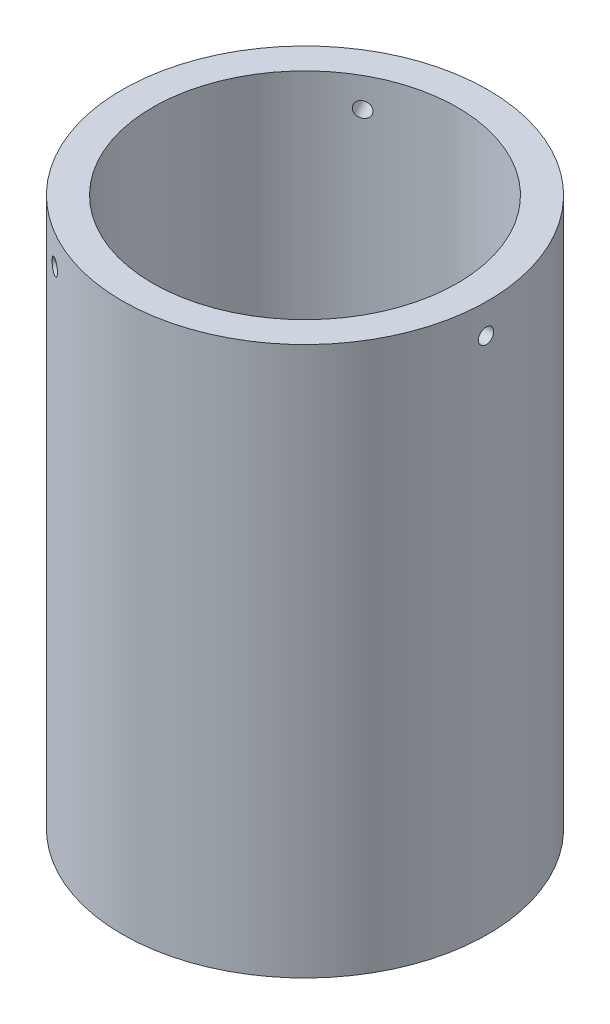
ISO-10303-21;
HEADER;
FILE_DESCRIPTION(('STEP AP214'),'2;1');
FILE_NAME('part.step','',(''),(''),'','','');
FILE_SCHEMA(('AUTOMOTIVE_DESIGN { 1 0 10303 214 1 1 1 1 }'));
ENDSEC;
DATA;
#1=APPLICATION_CONTEXT('core data for automotive mechanical design processes');
#2=APPLICATION_PROTOCOL_DEFINITION('international standard','automotive_design',2000,#1);
#3=PRODUCT_CONTEXT('',#1,'mechanical');
#4=PRODUCT('Part','Part','',(#3));
#5=PRODUCT_RELATED_PRODUCT_CATEGORY('part','',(#4));
#6=PRODUCT_DEFINITION_FORMATION('','',#4);
#7=PRODUCT_DEFINITION_CONTEXT('part definition',#1,'design');
#8=PRODUCT_DEFINITION('design','',#6,#7);
#9=PRODUCT_DEFINITION_SHAPE('','',#8);
#10=(LENGTH_UNIT() NAMED_UNIT(*) SI_UNIT(.MILLI.,.METRE.));
#11=(NAMED_UNIT(*) PLANE_ANGLE_UNIT() SI_UNIT($,.RADIAN.));
#12=(NAMED_UNIT(*) SI_UNIT($,.STERADIAN.) SOLID_ANGLE_UNIT());
#13=UNCERTAINTY_MEASURE_WITH_UNIT(LENGTH_MEASURE(1.E-05),#10,'distance_accuracy_value','');
#14=(GEOMETRIC_REPRESENTATION_CONTEXT(3) GLOBAL_UNCERTAINTY_ASSIGNED_CONTEXT((#13)) GLOBAL_UNIT_ASSIGNED_CONTEXT((#10,
#11,#12)) REPRESENTATION_CONTEXT('',''));
#15=CARTESIAN_POINT('',(0.,0.,0.));
#16=DIRECTION('',(0.,0.,1.));
#17=DIRECTION('',(1.,0.,0.));
#18=AXIS2_PLACEMENT_3D('',#15,#16,#17);
#19=CARTESIAN_POINT('',(0.524325322853207,57.15,0.));
#20=DIRECTION('',(0.,-1.,0.));
#21=DIRECTION('',(0.,0.,-1.));
#22=AXIS2_PLACEMENT_3D('',#19,#20,#21);
#23=CYLINDRICAL_SURFACE('',#22,19.05);
#24=CARTESIAN_POINT('',(-9.82954593201266,54.0771071788622,15.9906175627354));
#25=CARTESIAN_POINT('',(-9.82954434852659,54.1216716971803,15.9906187553507));
#26=CARTESIAN_POINT('',(-9.82638286301598,54.1662680363997,15.9926670155851));
#27=CARTESIAN_POINT('',(-9.81380900395984,54.2542310836286,16.0007978717827));
#28=CARTESIAN_POINT('',(-9.80438921677548,54.297596269597,16.0068852525125));
#29=CARTESIAN_POINT('',(-9.77954874057435,54.3818100082897,16.0228866408094));
#30=CARTESIAN_POINT('',(-9.76413105172987,54.4226598074057,16.0327987352207));
#31=CARTESIAN_POINT('',(-9.72770673753996,54.5006938149877,16.0561142232133));
#32=CARTESIAN_POINT('',(-9.70670145293859,54.5378788998727,16.0695167792418));
#33=CARTESIAN_POINT('',(-9.65964313605112,54.6075669482166,16.0993807704825));
#34=CARTESIAN_POINT('',(-9.63358684622303,54.6400668663604,16.1158441794469));
#35=CARTESIAN_POINT('',(-9.57713191323885,54.6994361673493,16.151290048846));
#36=CARTESIAN_POINT('',(-9.54673309499223,54.7263053230545,16.1702726108505));
#37=CARTESIAN_POINT('',(-9.48240483493424,54.7736576896073,16.2101598431927));
#38=CARTESIAN_POINT('',(-9.44847417709194,54.7941386912152,16.2310651752599));
#39=CARTESIAN_POINT('',(-9.37802074053883,54.8281191416972,16.2741434663804));
#40=CARTESIAN_POINT('',(-9.34149797703862,54.8416186315353,16.2963164179951));
#41=CARTESIAN_POINT('',(-9.26689655892963,54.8612452600571,16.3412474421869));
#42=CARTESIAN_POINT('',(-9.22881882882722,54.8673767152803,16.3640051641879));
#43=CARTESIAN_POINT('',(-9.15215863271631,54.8721065389167,16.4094528714539));
#44=CARTESIAN_POINT('',(-9.11357616974676,54.8707049526648,16.4321428571257));
#45=CARTESIAN_POINT('',(-9.037029497193,54.8604120805829,16.4768005631871));
#46=CARTESIAN_POINT('',(-8.9990649186873,54.8515254446254,16.4987687231891));
#47=CARTESIAN_POINT('',(-8.92482199034488,54.8265219346787,16.5414010514092));
#48=CARTESIAN_POINT('',(-8.88854364598074,54.810405037226,16.5620652153951));
#49=CARTESIAN_POINT('',(-8.81871704057504,54.7713931847818,16.601556271072));
#50=CARTESIAN_POINT('',(-8.78516963949477,54.7484961051881,16.6203825844013));
#51=CARTESIAN_POINT('',(-8.72180243896331,54.696575412407,16.655717928121));
#52=CARTESIAN_POINT('',(-8.69198265734013,54.6675517699199,16.6722269474287));
#53=CARTESIAN_POINT('',(-8.63693324506942,54.6041755246487,16.7025396850707));
#54=CARTESIAN_POINT('',(-8.61170712064986,54.569818888061,16.7163413375524));
#55=CARTESIAN_POINT('',(-8.56662826086208,54.4967661089699,16.7408997376705));
#56=CARTESIAN_POINT('',(-8.54677552662729,54.4580699655513,16.7516564846646));
#57=CARTESIAN_POINT('',(-8.51304257533806,54.3774342351118,16.7698792739291));
#58=CARTESIAN_POINT('',(-8.49916248358486,54.3354945800664,16.7773452471619));
#59=CARTESIAN_POINT('',(-8.47779784534191,54.2495634126189,16.7888185043612));
#60=CARTESIAN_POINT('',(-8.47031326541837,54.2055719109444,16.7928258064086));
#61=CARTESIAN_POINT('',(-8.46197161106166,54.1168212363338,16.7972911589465));
#62=CARTESIAN_POINT('',(-8.46110955731932,54.0720626655206,16.7977518760245));
#63=CARTESIAN_POINT('',(-8.46602620438848,53.9830172529529,16.7951209251837));
#64=CARTESIAN_POINT('',(-8.47180489005827,53.9387304101229,16.7920292653647));
#65=CARTESIAN_POINT('',(-8.48982314521721,53.8519013954258,16.7823636827461));
#66=CARTESIAN_POINT('',(-8.50206044683467,53.8093586167971,16.7757909822728));
#67=CARTESIAN_POINT('',(-8.5326224458669,53.7272066991916,16.7593107492151));
#68=CARTESIAN_POINT('',(-8.55094716757088,53.6875975719211,16.7494032033244));
#69=CARTESIAN_POINT('',(-8.59314335354518,53.6124113339665,16.7264712263987));
#70=CARTESIAN_POINT('',(-8.61701812769515,53.5768366482091,16.7134449353013));
#71=CARTESIAN_POINT('',(-8.66959277665119,53.5107535035182,16.6845817113847));
#72=CARTESIAN_POINT('',(-8.69829267344058,53.4802450676678,16.6687447657603));
#73=CARTESIAN_POINT('',(-8.75968377457365,53.4251415396562,16.6346297421111));
#74=CARTESIAN_POINT('',(-8.79237741865612,53.4005500896328,16.6163501712655));
#75=CARTESIAN_POINT('',(-8.86077803310485,53.3580034875127,16.5778126995379));
#76=CARTESIAN_POINT('',(-8.89648499336295,53.3400483131558,16.5575548052922));
#77=CARTESIAN_POINT('',(-8.96985710883972,53.3112903264261,16.5155921472992));
#78=CARTESIAN_POINT('',(-9.00752161798362,53.3004851702074,16.4938878602643));
#79=CARTESIAN_POINT('',(-9.08373059711564,53.2863262588868,16.4496110200764));
#80=CARTESIAN_POINT('',(-9.1222750641419,53.282972478708,16.4270384698459));
#81=CARTESIAN_POINT('',(-9.19911258204383,53.2838117865253,16.3816740402734));
#82=CARTESIAN_POINT('',(-9.23740580143958,53.2879991522915,16.3588823402745));
#83=CARTESIAN_POINT('',(-9.31269077350651,53.3037900824451,16.3137225050857));
#84=CARTESIAN_POINT('',(-9.34968252365833,53.3153936611878,16.2913543707158));
#85=CARTESIAN_POINT('',(-9.42133596722307,53.3456865739257,16.2477100798217));
#86=CARTESIAN_POINT('',(-9.45599763090672,53.3643759983081,16.2264339372308));
#87=CARTESIAN_POINT('',(-9.52203839698495,53.4083088404626,16.185628954206));
#88=CARTESIAN_POINT('',(-9.55341760864192,53.4335520399829,16.1661000556149));
#89=CARTESIAN_POINT('',(-9.61206406057454,53.4898954687272,16.1293927376268));
#90=CARTESIAN_POINT('',(-9.63932861047725,53.5209995004334,16.1122158567717));
#91=CARTESIAN_POINT('',(-9.68899575393487,53.5881826642396,16.0807785587604));
#92=CARTESIAN_POINT('',(-9.7113971459966,53.6242630221997,16.0665188623748));
#93=CARTESIAN_POINT('',(-9.75074790527878,53.7003961803141,16.0413814096768));
#94=CARTESIAN_POINT('',(-9.76769284167569,53.7404521744641,16.030506402083));
#95=CARTESIAN_POINT('',(-9.79564082292524,53.8233463938152,16.012528766292));
#96=CARTESIAN_POINT('',(-9.80665091835585,53.8661812496229,16.0054216620002));
#97=CARTESIAN_POINT('',(-9.81953771152996,53.93725485271,15.9970944276667));
#98=CARTESIAN_POINT('',(-9.82328632845081,53.9650327668101,15.994669178992));
#99=CARTESIAN_POINT('',(-9.82829093732607,54.020905294289,15.9914303708988));
#100=CARTESIAN_POINT('',(-9.82954693073258,54.0489999074834,15.9906168105415));
#101=CARTESIAN_POINT('',(-9.82954593201266,54.0771071788622,15.9906175627354));
#102=B_SPLINE_CURVE_WITH_KNOTS('',3,(#24,#25,#26,#27,#28,#29,#30,#31,#32,#33,#34,#35,#36,#37,
#38,#39,#40,#41,#42,#43,#44,#45,#46,#47,#48,#49,#50,#51,#52,#53,#54,#55,#56,#57,#58,#59,#60,#61,
#62,#63,#64,#65,#66,#67,#68,#69,#70,#71,#72,#73,#74,#75,#76,#77,#78,#79,#80,#81,#82,#83,#84,#85,
#86,#87,#88,#89,#90,#91,#92,#93,#94,#95,#96,#97,#98,#99,#100,#101),.UNSPECIFIED.,.T.,.F.,(4,2,2,
2,2,2,2,2,2,2,2,2,2,2,2,2,2,2,2,2,2,2,2,2,2,2,2,2,2,2,2,2,2,2,2,2,2,2,4),(0.,0.133590956048134,
0.267340447953975,0.401023123719305,0.534673751204672,0.668410862418218,0.80215336742834,
0.935942073965594,1.06972999548947,1.20343949951572,1.33714819886175,1.4707738967255,
1.60440002823342,1.73806807651517,1.87173676406412,2.00550705392612,2.13927737200503,
2.27305049634057,2.40682292134642,2.54049475641166,2.67416628668914,2.80779091088155,
2.94141606825107,3.07512112090191,3.20882678273082,3.34261453631118,3.47640184111922,
3.61014526738347,3.74388824354603,3.87752977814841,4.01117157143786,4.14481506952286,
4.27845411762478,4.4121801705723,4.54593922441234,4.67980662274163,4.81351463442204,
4.89777178752399,4.9820288915411),.UNSPECIFIED.);
#103=CARTESIAN_POINT('',(-9.82954593201266,54.0771071788622,15.9906175627354));
#104=VERTEX_POINT('',#103);
#105=EDGE_CURVE('E109',#104,#104,#102,.T.);
#106=ORIENTED_EDGE('',*,*,#105,.T.);
#107=EDGE_LOOP('',(#106));
#108=FACE_BOUND('',#107,.T.);
#109=CARTESIAN_POINT('',(-8.14702008124426,54.0771071788622,-16.9620243155951));
#110=CARTESIAN_POINT('',(-8.14702190582243,54.1216716971803,-16.9620235405635));
#111=CARTESIAN_POINT('',(-8.15037649397424,54.1662680363997,-16.9603097439148));
#112=CARTESIAN_POINT('',(-8.16370495152402,54.2542310836286,-16.9534858906474));
#113=CARTESIAN_POINT('',(-8.17368667147067,54.297596269597,-16.9483718060124));
#114=CARTESIAN_POINT('',(-8.1999645183322,54.3818100082897,-16.9348600167286));
#115=CARTESIAN_POINT('',(-8.21625748831936,54.4226598074057,-16.9264639537273));
#116=CARTESIAN_POINT('',(-8.25466145031749,54.5006938149877,-16.9065773163197));
#117=CARTESIAN_POINT('',(-8.2767710466145,54.5378788998727,-16.8950874842554));
#118=CARTESIAN_POINT('',(-8.32616318013105,54.6075669482166,-16.8692657819919));
#119=CARTESIAN_POINT('',(-8.35344905544122,54.6400668663604,-16.8549320775546));
#120=CARTESIAN_POINT('',(-8.4123735452921,54.6994361673493,-16.8237636061209));
#121=CARTESIAN_POINT('',(-8.44401233534023,54.7263053230545,-16.8069287382766));
#122=CARTESIAN_POINT('',(-8.51071982186421,54.7736576896073,-16.7711624470562));
#123=CARTESIAN_POINT('',(-8.54578969943014,54.7941386912152,-16.7522303014312));
#124=CARTESIAN_POINT('',(-8.61832331216867,54.8281191416972,-16.7127549811526));
#125=CARTESIAN_POINT('',(-8.65578703329395,54.8416186315353,-16.6922118159523));
#126=CARTESIAN_POINT('',(-8.73199915071664,54.8612452600571,-16.6500706048075));
#127=CARTESIAN_POINT('',(-8.770746781153,54.8673767152803,-16.6284731842209));
#128=CARTESIAN_POINT('',(-8.84843574824453,54.8721065389167,-16.5848073605627));
#129=CARTESIAN_POINT('',(-8.88737708373256,54.8707049526648,-16.5627389603264));
#130=CARTESIAN_POINT('',(-8.96432512793337,54.8604120805829,-16.5187764503504));
#131=CARTESIAN_POINT('',(-9.00233240182241,54.8515254446254,-16.4968822409215));
#132=CARTESIAN_POINT('',(-9.07637454525462,54.8265219346787,-16.4539021430356));
#133=CARTESIAN_POINT('',(-9.11240940839651,54.810405037226,-16.432816257202));
#134=CARTESIAN_POINT('',(-9.18152296853784,54.7713931847818,-16.3920901708991));
#135=CARTESIAN_POINT('',(-9.21460073468072,54.7484961051881,-16.3724504259973));
#136=CARTESIAN_POINT('',(-9.2768856402592,54.696575412407,-16.3352404924302));
#137=CARTESIAN_POINT('',(-9.30609276118277,54.6675517699199,-16.3176703136631));
#138=CARTESIAN_POINT('',(-9.35986906817435,54.6041755246487,-16.2851524929942));
#139=CARTESIAN_POINT('',(-9.38443471204753,54.5698188880609,-16.2702068546487));
#140=CARTESIAN_POINT('',(-9.42824234031999,54.4967661089699,-16.2434466169579));
#141=CARTESIAN_POINT('',(-9.44748432359632,54.4580699655513,-16.231632018273));
#142=CARTESIAN_POINT('',(-9.48013219767183,54.3774342351118,-16.2115298201442));
#143=CARTESIAN_POINT('',(-9.49353796603199,54.3354945800664,-16.2032422946955));
#144=CARTESIAN_POINT('',(-9.51415641735222,54.2495634126189,-16.1904766038341));
#145=CARTESIAN_POINT('',(-9.5213691326877,54.2055719109444,-16.1859984185073));
#146=CARTESIAN_POINT('',(-9.52940706860068,54.1168212363338,-16.1810070101938));
#147=CARTESIAN_POINT('',(-9.53023708816542,54.0720626655206,-16.1804908082925));
#148=CARTESIAN_POINT('',(-9.52550029436658,53.9830172529529,-16.1834332741354));
#149=CARTESIAN_POINT('',(-9.51993349558855,53.9387304101229,-16.1868919328164));
#150=CARTESIAN_POINT('',(-9.50255372791903,53.8519013954258,-16.1976634082067));
#151=CARTESIAN_POINT('',(-9.49074295152892,53.8093586167971,-16.2049748720445));
#152=CARTESIAN_POINT('',(-9.46118965152452,53.7272066991916,-16.223202223068));
#153=CARTESIAN_POINT('',(-9.44344710424207,53.6875975719211,-16.2341181246356));
#154=CARTESIAN_POINT('',(-9.40248933667828,53.6124113339665,-16.2591951051693));
#155=CARTESIAN_POINT('',(-9.37927085059581,53.5768366482091,-16.2733581205441));
#156=CARTESIAN_POINT('',(-9.32798724097095,53.5107535035182,-16.3044574901768));
#157=CARTESIAN_POINT('',(-9.29992209534712,53.4802450676678,-16.3213938570701));
#158=CARTESIAN_POINT('',(-9.23968206764973,53.4251415396562,-16.3575025983931));
#159=CARTESIAN_POINT('',(-9.20750467288589,53.4005500896328,-16.376676339288));
#160=CARTESIAN_POINT('',(-9.13992993614781,53.3580034875127,-16.4166442731713));
#161=CARTESIAN_POINT('',(-9.10453260497479,53.3400483131558,-16.4374384607238));
#162=CARTESIAN_POINT('',(-9.03150581940417,53.3112903264262,-16.4799992476596));
#163=CARTESIAN_POINT('',(-8.99387710088892,53.3004851702074,-16.5017655258819));
#164=CARTESIAN_POINT('',(-8.91742774292094,53.2863262588868,-16.5456260177127));
#165=CARTESIAN_POINT('',(-8.87860710747993,53.282972478708,-16.5677202302175));
#166=CARTESIAN_POINT('',(-8.80090160009106,53.2838117865253,-16.6115812578981));
#167=CARTESIAN_POINT('',(-8.76201679919867,53.2879991522915,-16.6333483086881));
#168=CARTESIAN_POINT('',(-8.68526474866097,53.3037900824451,-16.6759670894268));
#169=CARTESIAN_POINT('',(-8.64739750098546,53.3153936611878,-16.6968188176038));
#170=CARTESIAN_POINT('',(-8.57377371455862,53.3456865739257,-16.7370503745524));
#171=CARTESIAN_POINT('',(-8.53801720273862,53.3643759983081,-16.7564301845445));
#172=CARTESIAN_POINT('',(-8.46965866779899,53.4083088404626,-16.7932206741412));
#173=CARTESIAN_POINT('',(-8.4370565396827,53.4335520399829,-16.8106314192913));
#174=CARTESIAN_POINT('',(-8.37594384383391,53.4898954687272,-16.8430670775128));
#175=CARTESIAN_POINT('',(-8.34743595370424,53.5209995004334,-16.8580904299237));
#176=CARTESIAN_POINT('',(-8.29537688327132,53.5881826642396,-16.8853847888858));
#177=CARTESIAN_POINT('',(-8.27182692792022,53.6242630221997,-16.8976551152985));
#178=CARTESIAN_POINT('',(-8.23038187565625,53.7003961803141,-16.9191651461461));
#179=CARTESIAN_POINT('',(-8.2124913746152,53.7404521744641,-16.9284023877344));
#180=CARTESIAN_POINT('',(-8.18294829469548,53.8233463938152,-16.9436172315856));
#181=CARTESIAN_POINT('',(-8.17128831411611,53.8661812496229,-16.9495987017807));
#182=CARTESIAN_POINT('',(-8.157633321053,53.93725485271,-16.956595374876));
#183=CARTESIAN_POINT('',(-8.15365868562975,53.9650327668101,-16.9586291480211));
#184=CARTESIAN_POINT('',(-8.14835149110544,54.020905294289,-16.9613438623965));
#185=CARTESIAN_POINT('',(-8.14701893046522,54.0489999074834,-16.9620248044149));
#186=CARTESIAN_POINT('',(-8.14702008124426,54.0771071788622,-16.9620243155951));
#187=B_SPLINE_CURVE_WITH_KNOTS('',3,(#109,#110,#111,#112,#113,#114,#115,#116,#117,#118,#119,
#120,#121,#122,#123,#124,#125,#126,#127,#128,#129,#130,#131,#132,#133,#134,#135,#136,#137,#138,
#139,#140,#141,#142,#143,#144,#145,#146,#147,#148,#149,#150,#151,#152,#153,#154,#155,#156,#157,
#158,#159,#160,#161,#162,#163,#164,#165,#166,#167,#168,#169,#170,#171,#172,#173,#174,#175,#176,
#177,#178,#179,#180,#181,#182,#183,#184,#185,#186),.UNSPECIFIED.,.T.,.F.,(4,2,2,2,2,2,2,2,2,2,2,
2,2,2,2,2,2,2,2,2,2,2,2,2,2,2,2,2,2,2,2,2,2,2,2,2,2,2,4),(0.,0.133590956048134,
0.267340447953975,0.401023123719304,0.534673751204671,0.668410862418211,0.80215336742834,
0.935942073965595,1.06972999548947,1.20343949951572,1.33714819886175,1.4707738967255,
1.60440002823341,1.73806807651517,1.87173676406412,2.00550705392614,2.13927737200503,
2.27305049634057,2.40682292134642,2.54049475641165,2.67416628668914,2.80779091088155,
2.94141606825107,3.07512112090191,3.20882678273082,3.34261453631117,3.4764018411192,
3.61014526738346,3.74388824354602,3.8775297781484,4.01117157143786,4.14481506952285,
4.27845411762478,4.4121801705723,4.54593922441234,4.67980662274162,4.81351463442203,
4.89777178752398,4.9820288915411),.UNSPECIFIED.);
#188=CARTESIAN_POINT('',(-8.14702008124426,54.0771071788622,-16.9620243155951));
#189=VERTEX_POINT('',#188);
#190=EDGE_CURVE('E96',#189,#189,#187,.T.);
#191=ORIENTED_EDGE('',*,*,#190,.T.);
#192=EDGE_LOOP('',(#191));
#193=FACE_BOUND('',#192,.T.);
#194=CARTESIAN_POINT('',(19.5495419818166,54.0771071788622,0.971406752859766));
#195=CARTESIAN_POINT('',(19.5495422229087,54.1216716971803,0.971404785212967));
#196=CARTESIAN_POINT('',(19.5497353255499,54.1662680363997,0.96764272832991));
#197=CARTESIAN_POINT('',(19.5504899240435,54.2542310836286,0.952688018864843));
#198=CARTESIAN_POINT('',(19.5510518568058,54.297596269597,0.941486553500074));
#199=CARTESIAN_POINT('',(19.5524892274662,54.3818100082897,0.911973375919319));
#200=CARTESIAN_POINT('',(19.5533645086089,54.4226598074057,0.8936652185067));
#201=CARTESIAN_POINT('',(19.5553441564171,54.5006938149877,0.85046309310653));
#202=CARTESIAN_POINT('',(19.5564484681128,54.5378788998727,0.825570705013776));
#203=CARTESIAN_POINT('',(19.5587822847419,54.6075669482166,0.769885011509548));
#204=CARTESIAN_POINT('',(19.5600118702239,54.6400668663604,0.739087898107819));
#205=CARTESIAN_POINT('',(19.5624814270906,54.6994361673493,0.672473557275054));
#206=CARTESIAN_POINT('',(19.5637213988922,54.7263053230545,0.636656127426199));
#207=CARTESIAN_POINT('',(19.5661006253581,54.7736576896073,0.561002603863641));
#208=CARTESIAN_POINT('',(19.5672398450818,54.7941386912152,0.521165126171466));
#209=CARTESIAN_POINT('',(19.5693200212672,54.8281191416972,0.43861151477231));
#210=CARTESIAN_POINT('',(19.5702609788923,54.8416186315353,0.39589539795739));
#211=CARTESIAN_POINT('',(19.571871678206,54.8612452600571,0.308823162620732));
#212=CARTESIAN_POINT('',(19.5725415785399,54.8673767152803,0.264468020033086));
#213=CARTESIAN_POINT('',(19.5735703495205,54.8721065389167,0.175354489108963));
#214=CARTESIAN_POINT('',(19.573929222039,54.8707049526648,0.130596103200873));
#215=CARTESIAN_POINT('',(19.5743305936861,54.8604120805829,0.0419758871634395));
#216=CARTESIAN_POINT('',(19.5743732890694,54.8515254446254,-0.00188648226749738));
#217=CARTESIAN_POINT('',(19.5741725041592,54.8265219346787,-0.0874989083733791));
#218=CARTESIAN_POINT('',(19.573929022937,54.810405037226,-0.129248958192952));
#219=CARTESIAN_POINT('',(19.5732159776726,54.7713931847818,-0.209466100172778));
#220=CARTESIAN_POINT('',(19.5727463427352,54.7484961051881,-0.247932158403866));
#221=CARTESIAN_POINT('',(19.5716640477822,54.696575412407,-0.320477435690685));
#222=CARTESIAN_POINT('',(19.5710513870826,54.6675517699199,-0.354556633765487));
#223=CARTESIAN_POINT('',(19.5697782818035,54.6041755246487,-0.417387192076325));
#224=CARTESIAN_POINT('',(19.5691178012571,54.5698188880609,-0.446134482903566));
#225=CARTESIAN_POINT('',(19.5678465697418,54.4967661089699,-0.497453120712469));
#226=CARTESIAN_POINT('',(19.5672358187833,54.4580699655513,-0.520024466391405));
#227=CARTESIAN_POINT('',(19.5661507415696,54.3774342351118,-0.55834945378476));
#228=CARTESIAN_POINT('',(19.5656764181765,54.3354945800664,-0.574102952466285));
#229=CARTESIAN_POINT('',(19.5649302312538,54.2495634126189,-0.598341900526997));
#230=CARTESIAN_POINT('',(19.5646583666658,54.2055719109444,-0.606827387901147));
#231=CARTESIAN_POINT('',(19.564354648222,54.1168212363338,-0.61628414875257));
#232=CARTESIAN_POINT('',(19.5643226140444,54.0720626655206,-0.617261067731901));
#233=CARTESIAN_POINT('',(19.5645024673148,53.9830172529529,-0.61168765104816));
#234=CARTESIAN_POINT('',(19.5647143542065,53.9387304101229,-0.605137332548122));
#235=CARTESIAN_POINT('',(19.5653528416959,53.8519013954258,-0.584700274539328));
#236=CARTESIAN_POINT('',(19.5657793669233,53.8093586167971,-0.570816110228171));
#237=CARTESIAN_POINT('',(19.5667880659511,53.7272066991916,-0.53610852614695));
#238=CARTESIAN_POINT('',(19.5673702403726,53.6875975719211,-0.515285078688705));
#239=CARTESIAN_POINT('',(19.5686086587832,53.6124113339665,-0.467276121229304));
#240=CARTESIAN_POINT('',(19.5692649468507,53.5768366482091,-0.440086814757085));
#241=CARTESIAN_POINT('',(19.5705559861818,53.5107535035182,-0.380124221207832));
#242=CARTESIAN_POINT('',(19.5711907373474,53.4802450676678,-0.347350908690002));
#243=CARTESIAN_POINT('',(19.5723418107831,53.4251415396562,-0.27712714371791));
#244=CARTESIAN_POINT('',(19.5728580601017,53.4005500896328,-0.239673831977377));
#245=CARTESIAN_POINT('',(19.5736839378123,53.3580034875127,-0.161168426366518));
#246=CARTESIAN_POINT('',(19.5739935668974,53.3400483131558,-0.120116344568225));
#247=CARTESIAN_POINT('',(19.5743388968036,53.3112903264262,-0.0355928996394488));
#248=CARTESIAN_POINT('',(19.5743746874322,53.3004851702074,0.0078776656177194));
#249=CARTESIAN_POINT('',(19.5741343085963,53.2863262588868,0.0960149976364481));
#250=CARTESIAN_POINT('',(19.5738581401815,53.282972478708,0.140681760371806));
#251=CARTESIAN_POINT('',(19.5729901506946,53.2838117865253,0.229907217624828));
#252=CARTESIAN_POINT('',(19.5723985691979,53.2879991522915,0.274465968413705));
#253=CARTESIAN_POINT('',(19.5709314907272,53.3037900824451,0.362244584341276));
#254=CARTESIAN_POINT('',(19.5700559932035,53.3153936611878,0.40546444688815));
#255=CARTESIAN_POINT('',(19.5680856503414,53.3456865739257,0.489340294730916));
#256=CARTESIAN_POINT('',(19.566990802205,53.3643759983081,0.529996247313789));
#257=CARTESIAN_POINT('',(19.5646730333436,53.4083088404626,0.607591719935347));
#258=CARTESIAN_POINT('',(19.5634501168843,53.4335520399829,0.644531363676554));
#259=CARTESIAN_POINT('',(19.5609838729681,53.4898954687272,0.713674339886069));
#260=CARTESIAN_POINT('',(19.5597405327412,53.5209995004334,0.745874573152129));
#261=CARTESIAN_POINT('',(19.5573486057659,53.5881826642396,0.804606230125472));
#262=CARTESIAN_POINT('',(19.5562000424765,53.6242630221997,0.831136252923897));
#263=CARTESIAN_POINT('',(19.5541057494947,53.7003961803141,0.877783736469458));
#264=CARTESIAN_POINT('',(19.5531601848506,53.7404521744641,0.897895985651604));
#265=CARTESIAN_POINT('',(19.5515650861804,53.8233463938152,0.931088465293678));
#266=CARTESIAN_POINT('',(19.5509152010316,53.8661812496229,0.944177039780591));
#267=CARTESIAN_POINT('',(19.5501470011426,53.93725485271,0.959500947209424));
#268=CARTESIAN_POINT('',(19.5499209826402,53.96503276681,0.96395996902931));
#269=CARTESIAN_POINT('',(19.5496183969912,54.020905294289,0.969913491497881));
#270=CARTESIAN_POINT('',(19.5495418297575,54.0489999074834,0.971407993873574));
#271=CARTESIAN_POINT('',(19.5495419818166,54.0771071788622,0.971406752859766));
#272=B_SPLINE_CURVE_WITH_KNOTS('',3,(#194,#195,#196,#197,#198,#199,#200,#201,#202,#203,#204,
#205,#206,#207,#208,#209,#210,#211,#212,#213,#214,#215,#216,#217,#218,#219,#220,#221,#222,#223,
#224,#225,#226,#227,#228,#229,#230,#231,#232,#233,#234,#235,#236,#237,#238,#239,#240,#241,#242,
#243,#244,#245,#246,#247,#248,#249,#250,#251,#252,#253,#254,#255,#256,#257,#258,#259,#260,#261,
#262,#263,#264,#265,#266,#267,#268,#269,#270,#271),.UNSPECIFIED.,.T.,.F.,(4,2,2,2,2,2,2,2,2,2,2,
2,2,2,2,2,2,2,2,2,2,2,2,2,2,2,2,2,2,2,2,2,2,2,2,2,2,2,4),(0.,0.133590956048134,
0.267340447953975,0.401023123719304,0.534673751204671,0.668410862418222,0.802153367428341,
0.935942073965595,1.06972999548947,1.20343949951572,1.33714819886175,1.4707738967255,
1.60440002823341,1.73806807651516,1.87173676406412,2.00550705392614,2.13927737200503,
2.27305049634057,2.40682292134642,2.54049475641165,2.67416628668914,2.80779091088154,
2.94141606825107,3.07512112090192,3.20882678273082,3.34261453631117,3.47640184111921,
3.61014526738346,3.74388824354602,3.8775297781484,4.01117157143786,4.14481506952285,
4.27845411762478,4.4121801705723,4.54593922441234,4.67980662274162,4.81351463442203,
4.89777178752398,4.9820288915411),.UNSPECIFIED.);
#273=CARTESIAN_POINT('',(19.5495419818166,54.0771071788622,0.971406752859766));
#274=VERTEX_POINT('',#273);
#275=EDGE_CURVE('E71',#274,#274,#272,.T.);
#276=ORIENTED_EDGE('',*,*,#275,.T.);
#277=EDGE_LOOP('',(#276));
#278=FACE_BOUND('',#277,.T.);
#279=CARTESIAN_POINT('',(0.524325322853207,57.15,0.));
#280=DIRECTION('',(0.,1.,0.));
#281=DIRECTION('',(0.,0.,1.));
#282=AXIS2_PLACEMENT_3D('',#279,#280,#281);
#283=CIRCLE('',#282,19.05);
#284=CARTESIAN_POINT('',(0.524325322853207,57.15,19.05));
#285=VERTEX_POINT('',#284);
#286=EDGE_CURVE('E10',#285,#285,#283,.T.);
#287=ORIENTED_EDGE('',*,*,#286,.F.);
#288=EDGE_LOOP('',(#287));
#289=FACE_BOUND('',#288,.T.);
#290=CARTESIAN_POINT('',(0.524325322853207,0.,0.));
#291=DIRECTION('',(0.,1.,0.));
#292=DIRECTION('',(0.,0.,1.));
#293=AXIS2_PLACEMENT_3D('',#290,#291,#292);
#294=CIRCLE('',#293,19.05);
#295=CARTESIAN_POINT('',(0.524325322853207,0.,19.05));
#296=VERTEX_POINT('',#295);
#297=EDGE_CURVE('E48',#296,#296,#294,.T.);
#298=ORIENTED_EDGE('',*,*,#297,.T.);
#299=EDGE_LOOP('',(#298));
#300=FACE_BOUND('',#299,.T.);
#301=ADVANCED_FACE('F40',(#108,#193,#278,#289,#300),#23,.T.);
#302=CARTESIAN_POINT('',(0.524325322853207,57.15,0.));
#303=DIRECTION('',(0.,1.,0.));
#304=DIRECTION('',(0.,0.,1.));
#305=AXIS2_PLACEMENT_3D('',#302,#303,#304);
#306=PLANE('',#305);
#307=CARTESIAN_POINT('',(0.524325322853207,57.15,0.));
#308=DIRECTION('',(0.,1.,0.));
#309=DIRECTION('',(0.,0.,1.));
#310=AXIS2_PLACEMENT_3D('',#307,#308,#309);
#311=CIRCLE('',#310,15.875);
#312=CARTESIAN_POINT('',(0.524325322853207,57.15,15.875));
#313=VERTEX_POINT('',#312);
#314=EDGE_CURVE('E55',#313,#313,#311,.T.);
#315=ORIENTED_EDGE('',*,*,#314,.F.);
#316=EDGE_LOOP('',(#315));
#317=FACE_BOUND('',#316,.T.);
#318=ORIENTED_EDGE('',*,*,#286,.T.);
#319=EDGE_LOOP('',(#318));
#320=FACE_BOUND('',#319,.T.);
#321=ADVANCED_FACE('F126',(#317,#320),#306,.T.);
#322=CARTESIAN_POINT('',(0.524325322853207,0.,0.));
#323=DIRECTION('',(0.,1.,0.));
#324=DIRECTION('',(0.,0.,1.));
#325=AXIS2_PLACEMENT_3D('',#322,#323,#324);
#326=PLANE('',#325);
#327=CARTESIAN_POINT('',(0.,0.,0.));
#328=DIRECTION('',(0.,-1.,0.));
#329=DIRECTION('',(0.,0.,-1.));
#330=AXIS2_PLACEMENT_3D('',#327,#328,#329);
#331=CIRCLE('',#330,6.35);
#332=CARTESIAN_POINT('',(0.,0.,-6.35));
#333=VERTEX_POINT('',#332);
#334=EDGE_CURVE('E60',#333,#333,#331,.T.);
#335=ORIENTED_EDGE('',*,*,#334,.F.);
#336=EDGE_LOOP('',(#335));
#337=FACE_BOUND('',#336,.T.);
#338=ORIENTED_EDGE('',*,*,#297,.F.);
#339=EDGE_LOOP('',(#338));
#340=FACE_BOUND('',#339,.T.);
#341=ADVANCED_FACE('F131',(#337,#340),#326,.F.);
#342=CARTESIAN_POINT('',(0.524325322853207,3.175,0.));
#343=DIRECTION('',(0.,1.,0.));
#344=DIRECTION('',(0.,0.,1.));
#345=AXIS2_PLACEMENT_3D('',#342,#343,#344);
#346=CYLINDRICAL_SURFACE('',#345,15.875);
#347=CARTESIAN_POINT('',(-7.54117791323361,54.8708571788622,13.6734517422878));
#348=CARTESIAN_POINT('',(-7.5795542407287,54.8708552124998,13.650814546207));
#349=CARTESIAN_POINT('',(-7.61786173198003,54.8670930479478,13.6279984602818));
#350=CARTESIAN_POINT('',(-7.69323520608891,54.8521383815215,13.5826825126117));
#351=CARTESIAN_POINT('',(-7.73029967204736,54.840937125001,13.5601830553857));
#352=CARTESIAN_POINT('',(-7.80211037198795,54.811425780411,13.5162075165369));
#353=CARTESIAN_POINT('',(-7.83685777685295,54.7931193152172,13.4947309196232));
#354=CARTESIAN_POINT('',(-7.90309473670175,54.7499227731071,13.4534657539921));
#355=CARTESIAN_POINT('',(-7.93458505830249,54.7250342503319,13.4336767882516));
#356=CARTESIAN_POINT('',(-7.99349991460739,54.6693520954324,13.3963986447477));
#357=CARTESIAN_POINT('',(-8.02092083170522,54.6385532642869,13.3789115148054));
#358=CARTESIAN_POINT('',(-8.07093674703125,54.5719351365284,13.346834083969));
#359=CARTESIAN_POINT('',(-8.09353154812192,54.5361156349295,13.3322439014114));
#360=CARTESIAN_POINT('',(-8.13331005976359,54.460451149588,13.3064472713627));
#361=CARTESIAN_POINT('',(-8.15049101769516,54.4206041316457,13.295242545295));
#362=CARTESIAN_POINT('',(-8.17897618319718,54.3380300428426,13.2766132444694));
#363=CARTESIAN_POINT('',(-8.19028043536428,54.2953029938402,13.2691886410252));
#364=CARTESIAN_POINT('',(-8.20671012458398,54.2082199388393,13.258383862351));
#365=CARTESIAN_POINT('',(-8.2118407701541,54.1638653385722,13.2550002778323));
#366=CARTESIAN_POINT('',(-8.21580687783672,54.0747543260066,13.2523854467731));
#367=CARTESIAN_POINT('',(-8.21464238962782,54.0299979168819,13.2531541674642));
#368=CARTESIAN_POINT('',(-8.20605258855037,53.941396024311,13.2588141388374));
#369=CARTESIAN_POINT('',(-8.19863289412176,53.8975497595713,13.2637016899753));
#370=CARTESIAN_POINT('',(-8.17773314751974,53.8119699820944,13.2774228801792));
#371=CARTESIAN_POINT('',(-8.16425306973752,53.7702364782858,13.2862565359198));
#372=CARTESIAN_POINT('',(-8.1315762381762,53.6900452396835,13.3075682197791));
#373=CARTESIAN_POINT('',(-8.11237689986656,53.6515889960079,13.320047895483));
#374=CARTESIAN_POINT('',(-8.06876580690995,53.5790602191111,13.3482239089034));
#375=CARTESIAN_POINT('',(-8.04435401547763,53.5449877168297,13.3639202693208));
#376=CARTESIAN_POINT('',(-7.99093122155891,53.4821545095943,13.3980235081825));
#377=CARTESIAN_POINT('',(-7.96191520574746,53.4533996695661,13.4164333396265));
#378=CARTESIAN_POINT('',(-7.90007687574098,53.4020632251192,13.4553485617314));
#379=CARTESIAN_POINT('',(-7.86725456060969,53.3794816222189,13.4758539529078));
#380=CARTESIAN_POINT('',(-7.79869017151406,53.3411332235976,13.5183084040779));
#381=CARTESIAN_POINT('',(-7.76294800990713,53.3253666325266,13.5402575074024));
#382=CARTESIAN_POINT('',(-7.68952782127961,53.3010996469494,13.5849212937378));
#383=CARTESIAN_POINT('',(-7.65184980875354,53.2925991980469,13.6076359710161));
#384=CARTESIAN_POINT('',(-7.57565308667975,53.2831130219587,13.6531293503863));
#385=CARTESIAN_POINT('',(-7.53713532980114,53.2821191825392,13.6759079567426));
#386=CARTESIAN_POINT('',(-7.46031233739854,53.2876532666521,13.720902604572));
#387=CARTESIAN_POINT('',(-7.4220071011721,53.2941811653077,13.7431186479055));
#388=CARTESIAN_POINT('',(-7.34673017553497,53.3145667080955,13.7863698927712));
#389=CARTESIAN_POINT('',(-7.30975782230294,53.3284206481973,13.8074056850963));
#390=CARTESIAN_POINT('',(-7.23820151848142,53.3630612558696,13.847761226889));
#391=CARTESIAN_POINT('',(-7.20361758164168,53.3838479633469,13.8670809664777));
#392=CARTESIAN_POINT('',(-7.1378269874684,53.431784816376,13.9035414479304));
#393=CARTESIAN_POINT('',(-7.10662324970216,53.4589403998302,13.9206803083078));
#394=CARTESIAN_POINT('',(-7.04855581090511,53.5188362123221,13.9523543715176));
#395=CARTESIAN_POINT('',(-7.02169213771977,53.5515764771879,13.966889557645));
#396=CARTESIAN_POINT('',(-6.97309165299991,53.6217471740659,13.9930385603186));
#397=CARTESIAN_POINT('',(-6.95135940255672,53.6591817337203,14.0046497784859));
#398=CARTESIAN_POINT('',(-6.91371479525579,53.7376575330038,14.0246797050053));
#399=CARTESIAN_POINT('',(-6.89780241306947,53.7786987569354,14.0330984272515));
#400=CARTESIAN_POINT('',(-6.87229312889099,53.8632034297044,14.0465607840737));
#401=CARTESIAN_POINT('',(-6.86269327320077,53.9066657353506,14.051605997169));
#402=CARTESIAN_POINT('',(-6.85009471703158,53.9947948350274,14.0582219887975));
#403=CARTESIAN_POINT('',(-6.84709597907519,54.0394616222182,14.0597927870563));
#404=CARTESIAN_POINT('',(-6.8477924675631,54.1286795101244,14.059427597454));
#405=CARTESIAN_POINT('',(-6.85148037044524,54.1732306839527,14.0574954462084));
#406=CARTESIAN_POINT('',(-6.86542133185815,54.2610015823542,14.050171903838));
#407=CARTESIAN_POINT('',(-6.87567440290108,54.3042213043898,14.0447805061205));
#408=CARTESIAN_POINT('',(-6.90242892792125,54.3881041808481,14.0306512184223));
#409=CARTESIAN_POINT('',(-6.91893042775439,54.428767316506,14.0219133038823));
#410=CARTESIAN_POINT('',(-6.95767540805612,54.506385342559,14.001277431014));
#411=CARTESIAN_POINT('',(-6.97991871234626,54.543340346684,13.9893795696434));
#412=CARTESIAN_POINT('',(-7.02949690952869,54.6125343326332,13.962671165097));
#413=CARTESIAN_POINT('',(-7.05683679834127,54.6447686311514,13.9478577631645));
#414=CARTESIAN_POINT('',(-7.11578009415358,54.7035730643328,13.9156580690013));
#415=CARTESIAN_POINT('',(-7.14738454837197,54.7301418035972,13.8982711447072));
#416=CARTESIAN_POINT('',(-7.21393828397362,54.7768733532343,13.861325707647));
#417=CARTESIAN_POINT('',(-7.24889074123856,54.7970300012764,13.8417651301028));
#418=CARTESIAN_POINT('',(-7.32105884506329,54.8303100147046,13.8009884738698));
#419=CARTESIAN_POINT('',(-7.3582717602425,54.8434416874771,13.779774384722));
#420=CARTESIAN_POINT('',(-7.41995776157494,54.8588545267337,13.7442626678006));
#421=CARTESIAN_POINT('',(-7.44408647041351,54.8633497748725,13.7302885897556));
#422=CARTESIAN_POINT('',(-7.49254529246155,54.8693517222792,13.7020508350534));
#423=CARTESIAN_POINT('',(-7.51687540549915,54.870858424097,13.6877871586434));
#424=CARTESIAN_POINT('',(-7.54117791323361,54.8708571788622,13.6734517422878));
#425=B_SPLINE_CURVE_WITH_KNOTS('',3,(#347,#348,#349,#350,#351,#352,#353,#354,#355,#356,#357,
#358,#359,#360,#361,#362,#363,#364,#365,#366,#367,#368,#369,#370,#371,#372,#373,#374,#375,#376,
#377,#378,#379,#380,#381,#382,#383,#384,#385,#386,#387,#388,#389,#390,#391,#392,#393,#394,#395,
#396,#397,#398,#399,#400,#401,#402,#403,#404,#405,#406,#407,#408,#409,#410,#411,#412,#413,#414,
#415,#416,#417,#418,#419,#420,#421,#422,#423,#424),.UNSPECIFIED.,.T.,.F.,(4,2,2,2,2,2,2,2,2,2,2,
2,2,2,2,2,2,2,2,2,2,2,2,2,2,2,2,2,2,2,2,2,2,2,2,2,2,2,4),(0.,0.133563252926492,
0.267283968076178,0.40093658974176,0.534557681772384,0.66829685731819,0.802041494806665,
0.935854024227027,1.06966553816714,1.20336407934588,1.33706156543224,1.47063909192869,
1.60421718287659,1.73785572949674,1.87149521926295,2.00528123416769,2.13906728198052,
2.27285734701343,2.40664641044995,2.54029087016713,2.67393488788148,2.80751139998922,
2.94108868101304,3.07478043149439,3.20847303969643,3.3422840376446,3.47609445322842,
3.60984221286267,3.74358921315066,3.87718981513908,4.01079067174992,4.14439250884834,
4.27799024706693,4.41171963957475,4.54548193101358,4.67937238883017,4.81310416247545,
4.89768559506161,4.98226695547709),.UNSPECIFIED.);
#426=CARTESIAN_POINT('',(-7.54117791323361,54.8708571788622,13.6734517422878));
#427=VERTEX_POINT('',#426);
#428=EDGE_CURVE('E102',#427,#427,#425,.T.);
#429=ORIENTED_EDGE('',*,*,#428,.T.);
#430=EDGE_LOOP('',(#429));
#431=FACE_BOUND('',#430,.T.);
#432=CARTESIAN_POINT('',(-7.28447962534514,54.8708571788622,-13.8216565679007));
#433=CARTESIAN_POINT('',(-7.24568707472115,54.8708552124998,-13.843572844375));
#434=CARTESIAN_POINT('',(-7.2067740190694,54.8670930479478,-13.8653400619913));
#435=CARTESIAN_POINT('',(-7.12984252013603,54.8521383815215,-13.907957431506));
#436=CARTESIAN_POINT('',(-7.09182518562777,54.840937125001,-13.9288064719908));
#437=CARTESIAN_POINT('',(-7.01783590186927,54.811425780411,-13.9690085929785));
#438=CARTESIAN_POINT('',(-6.9818629209227,54.7931193152172,-13.9883624298503));
#439=CARTESIAN_POINT('',(-6.91300775927035,54.7499227731071,-14.0250927369332));
#440=CARTESIAN_POINT('',(-6.88012485142407,54.7250342503319,-14.0424696725426));
#441=CARTESIAN_POINT('',(-6.81838360399137,54.6693520954324,-14.074852363011));
#442=CARTESIAN_POINT('',(-6.78952884667312,54.6385532642869,-14.0898560088416));
#443=CARTESIAN_POINT('',(-6.73674101901768,54.5719351365283,-14.1171323466893));
#444=CARTESIAN_POINT('',(-6.71280814973158,54.5361156349295,-14.1294049271485));
#445=CARTESIAN_POINT('',(-6.67057835695655,54.460451149588,-14.1509558137305));
#446=CARTESIAN_POINT('',(-6.65228430057367,54.4206041316457,-14.1602325967268));
#447=CARTESIAN_POINT('',(-6.62190827005293,54.3380300428425,-14.1755868232697));
#448=CARTESIAN_POINT('',(-6.6098262487737,54.2953029938402,-14.1816642910951));
#449=CARTESIAN_POINT('',(-6.59225419134972,54.2082199388393,-14.1904904299986));
#450=CARTESIAN_POINT('',(-6.58675859841567,54.1638653385722,-14.1932419071408));
#451=CARTESIAN_POINT('',(-6.58251103445046,54.0747543260066,-14.1953692416185));
#452=CARTESIAN_POINT('',(-6.58375901020183,54.0299979168818,-14.1947451255927));
#453=CARTESIAN_POINT('',(-6.59295558973441,53.941396024311,-14.1901361253327));
#454=CARTESIAN_POINT('',(-6.60089818039648,53.8975497595713,-14.1861542570382));
#455=CARTESIAN_POINT('',(-6.62323095298419,53.8119699820944,-14.1749151406502));
#456=CARTESIAN_POINT('',(-6.63762116215495,53.7702364782858,-14.1676578787161));
#457=CARTESIAN_POINT('',(-6.6724160375552,53.6900452396835,-14.1500147543984));
#458=CARTESIAN_POINT('',(-6.69282342290058,53.6515889960079,-14.1396274775384));
#459=CARTESIAN_POINT('',(-6.73903011277835,53.5790602191111,-14.1159471698614));
#460=CARTESIAN_POINT('',(-6.76482945536288,53.5449877168297,-14.1026541185378));
#461=CARTESIAN_POINT('',(-6.82107512352781,53.4821545095943,-14.0734402412939));
#462=CARTESIAN_POINT('',(-6.8515265131434,53.4533996695661,-14.0575165502065));
#463=CARTESIAN_POINT('',(-6.91614724908344,53.4020632251192,-14.0234205965458));
#464=CARTESIAN_POINT('',(-6.95031659632242,53.3794816222189,-14.0052483334193));
#465=CARTESIAN_POINT('',(-7.02136542408725,53.3411332235976,-13.9670970562525));
#466=CARTESIAN_POINT('',(-7.05824498596,53.3253666325266,-13.947117987977));
#467=CARTESIAN_POINT('',(-7.13363505386943,53.3010996469494,-13.9058661326426));
#468=CARTESIAN_POINT('',(-7.17214554769426,53.2925991980469,-13.8845933552701));
#469=CARTESIAN_POINT('',(-7.24964233096971,53.2831130219587,-13.8413517479542));
#470=CARTESIAN_POINT('',(-7.28862806117641,53.2821191825392,-13.8193836951787));
#471=CARTESIAN_POINT('',(-7.36600606543232,53.2876532666521,-13.775350356078));
#472=CARTESIAN_POINT('',(-7.40439834144386,53.2941811653077,-13.7532850700747));
#473=CARTESIAN_POINT('',(-7.47949348106145,53.3145667080955,-13.709718962587));
#474=CARTESIAN_POINT('',(-7.51619718821972,53.3284206481973,-13.6882178616129));
#475=CARTESIAN_POINT('',(-7.58692426450646,53.3630612558696,-13.6464260555989));
#476=CARTESIAN_POINT('',(-7.62094761820469,53.3838479633469,-13.6261353575272));
#477=CARTESIAN_POINT('',(-7.68541861846357,53.431784816376,-13.5873892723694));
#478=CARTESIAN_POINT('',(-7.71586317582544,53.4589403998302,-13.5689354729595));
#479=CARTESIAN_POINT('',(-7.77232743860465,53.5188362123221,-13.5344846274334));
#480=CARTESIAN_POINT('',(-7.7983471156324,53.5515764771879,-13.5184875970797));
#481=CARTESIAN_POINT('',(-7.8452930585913,53.6217471740659,-13.4894728440128));
#482=CARTESIAN_POINT('',(-7.86621479371466,53.6591817337203,-13.4764577721313));
#483=CARTESIAN_POINT('',(-7.9023835225669,53.7376575330038,-13.4538715491529));
#484=CARTESIAN_POINT('',(-7.91763054099265,53.7786987569354,-13.4443003830679));
#485=CARTESIAN_POINT('',(-7.9420439260847,53.8632034297044,-13.4289398733481));
#486=CARTESIAN_POINT('',(-7.95121313663791,53.9066657353506,-13.4231487609954));
#487=CARTESIAN_POINT('',(-7.96324203154393,53.9947948350275,-13.415546087116));
#488=CARTESIAN_POINT('',(-7.96610175171848,54.0394616222182,-13.4137345029959));
#489=CARTESIAN_POINT('',(-7.96543724400177,54.1286795101244,-13.4141550849188));
#490=CARTESIAN_POINT('',(-7.96192000049806,54.1732306839527,-13.4163828268786));
#491=CARTESIAN_POINT('',(-7.94860714605317,54.2610015823543,-13.4247942824302));
#492=CARTESIAN_POINT('',(-7.9388115231464,54.3042213043898,-13.4309780035614));
#493=CARTESIAN_POINT('',(-7.91319793855234,54.3881041808481,-13.447083458046));
#494=CARTESIAN_POINT('',(-7.89737993266803,54.428767316506,-13.457005218832));
#495=CARTESIAN_POINT('',(-7.86013625238389,54.506385342559,-13.4802414196082));
#496=CARTESIAN_POINT('',(-7.83871075004119,54.543340346684,-13.4935557555023));
#497=CARTESIAN_POINT('',(-7.79079149461827,54.6125343326332,-13.523137531463));
#498=CARTESIAN_POINT('',(-7.76429276782194,54.6447686311514,-13.539407868745));
#499=CARTESIAN_POINT('',(-7.70693536677633,54.7035730643328,-13.5743544132197));
#500=CARTESIAN_POINT('',(-7.6760756215348,54.7301418035972,-13.5930312112985));
#501=CARTESIAN_POINT('',(-7.61080306668589,54.7768733532344,-13.6321957185162));
#502=CARTESIAN_POINT('',(-7.57638688098748,54.7970300012764,-13.6526851456602));
#503=CARTESIAN_POINT('',(-7.50498920889593,54.8303100147046,-13.6947962287989));
#504=CARTESIAN_POINT('',(-7.46801081118622,54.8434416874771,-13.716416514119));
#505=CARTESIAN_POINT('',(-7.40641376153407,54.8588545267337,-13.7520822998701));
#506=CARTESIAN_POINT('',(-7.38224750053331,54.8633497748725,-13.7659913356623));
#507=CARTESIAN_POINT('',(-7.33356347659137,54.8693517222792,-13.7938390292423));
#508=CARTESIAN_POINT('',(-7.30904571395013,54.870858424097,-13.8077776870048));
#509=CARTESIAN_POINT('',(-7.28447962534514,54.8708571788622,-13.8216565679007));
#510=B_SPLINE_CURVE_WITH_KNOTS('',3,(#432,#433,#434,#435,#436,#437,#438,#439,#440,#441,#442,
#443,#444,#445,#446,#447,#448,#449,#450,#451,#452,#453,#454,#455,#456,#457,#458,#459,#460,#461,
#462,#463,#464,#465,#466,#467,#468,#469,#470,#471,#472,#473,#474,#475,#476,#477,#478,#479,#480,
#481,#482,#483,#484,#485,#486,#487,#488,#489,#490,#491,#492,#493,#494,#495,#496,#497,#498,#499,
#500,#501,#502,#503,#504,#505,#506,#507,#508,#509),.UNSPECIFIED.,.T.,.F.,(4,2,2,2,2,2,2,2,2,2,2,
2,2,2,2,2,2,2,2,2,2,2,2,2,2,2,2,2,2,2,2,2,2,2,2,2,2,2,4),(0.,0.133563252926493,
0.267283968076182,0.400936589741763,0.534557681772388,0.668296857318198,0.802041494806673,
0.935854024227036,1.06966553816715,1.2033640793459,1.33706156543225,1.47063909192871,
1.6042171828766,1.73785572949674,1.87149521926295,2.00528123416769,2.13906728198053,
2.27285734701344,2.40664641044996,2.54029087016714,2.67393488788149,2.80751139998923,
2.94108868101304,3.07478043149439,3.20847303969644,3.3422840376446,3.47609445322842,
3.60984221286269,3.74358921315067,3.8771898151391,4.01079067174993,4.14439250884836,
4.27799024706693,4.41171963957476,4.5454819310136,4.67937238883018,4.81310416247546,
4.89768559506161,4.98226695547709),.UNSPECIFIED.);
#511=CARTESIAN_POINT('',(-7.28447962534514,54.8708571788622,-13.8216565679007));
#512=VERTEX_POINT('',#511);
#513=EDGE_CURVE('E90',#512,#512,#510,.T.);
#514=ORIENTED_EDGE('',*,*,#513,.T.);
#515=EDGE_LOOP('',(#514));
#516=FACE_BOUND('',#515,.T.);
#517=CARTESIAN_POINT('',(16.3986335071384,54.8708571788622,0.148204825613035));
#518=CARTESIAN_POINT('',(16.3982172840095,54.8708552124998,0.19275829816815));
#519=CARTESIAN_POINT('',(16.3976117196091,54.8670930479478,0.237341601709608));
#520=CARTESIAN_POINT('',(16.3960536947846,54.8521383815215,0.325274918894469));
#521=CARTESIAN_POINT('',(16.3951008262348,54.840937125001,0.368623416605166));
#522=CARTESIAN_POINT('',(16.3929222424169,54.811425780411,0.452801076441682));
#523=CARTESIAN_POINT('',(16.3916966663353,54.7931193152172,0.493631510227186));
#524=CARTESIAN_POINT('',(16.3890784645318,54.7499227731071,0.571626982941272));
#525=CARTESIAN_POINT('',(16.3876858782862,54.7250342503319,0.608792884291112));
#526=CARTESIAN_POINT('',(16.3848594871584,54.6693520954324,0.67845371826339));
#527=CARTESIAN_POINT('',(16.383425646938,54.6385532642869,0.710944494036343));
#528=CARTESIAN_POINT('',(16.3806537346086,54.5719351365283,0.770298262720397));
#529=CARTESIAN_POINT('',(16.3793156664132,54.5361156349295,0.797161025737193));
#530=CARTESIAN_POINT('',(16.3768643852798,54.460451149588,0.844508542367959));
#531=CARTESIAN_POINT('',(16.3757512868285,54.4206041316457,0.864990051431912));
#532=CARTESIAN_POINT('',(16.3738604218098,54.3380300428426,0.898973578800468));
#533=CARTESIAN_POINT('',(16.3730826526977,54.2953029938402,0.912475650070047));
#534=CARTESIAN_POINT('',(16.3719402844934,54.2082199388393,0.932106567647695));
#535=CARTESIAN_POINT('',(16.3715753371295,54.1638653385722,0.938241629308554));
#536=CARTESIAN_POINT('',(16.3712938808469,54.0747543260066,0.942983794845461));
#537=CARTESIAN_POINT('',(16.3713773683893,54.0299979168819,0.941590958128587));
#538=CARTESIAN_POINT('',(16.3719841468445,53.941396024311,0.931321986495475));
#539=CARTESIAN_POINT('',(16.3725070430779,53.8975497595713,0.922452567063013));
#540=CARTESIAN_POINT('',(16.3739400690636,53.8119699820944,0.897492260471071));
#541=CARTESIAN_POINT('',(16.3748502004521,53.7702364782858,0.881401342796378));
#542=CARTESIAN_POINT('',(16.3769682442911,53.6900452396835,0.84244653461943));
#543=CARTESIAN_POINT('',(16.3781762913268,53.6515889960079,0.819579582055488));
#544=CARTESIAN_POINT('',(16.380771888248,53.5790602191111,0.767723260958043));
#545=CARTESIAN_POINT('',(16.3821594394002,53.5449877168297,0.738733849217092));
#546=CARTESIAN_POINT('',(16.3849823136464,53.4821545095943,0.675416733111494));
#547=CARTESIAN_POINT('',(16.3864176874505,53.4533996695661,0.64108321058019));
#548=CARTESIAN_POINT('',(16.3892000933841,53.4020632251192,0.568072034814495));
#549=CARTESIAN_POINT('',(16.3905471254918,53.3794816222189,0.529394380511557));
#550=CARTESIAN_POINT('',(16.393031564161,53.3411332235976,0.448788652174733));
#551=CARTESIAN_POINT('',(16.3941689644268,53.3253666325266,0.406860480574725));
#552=CARTESIAN_POINT('',(16.3961388437087,53.3010996469494,0.320944838904942));
#553=CARTESIAN_POINT('',(16.3969713250075,53.2925991980469,0.276957384254101));
#554=CARTESIAN_POINT('',(16.3982713862091,53.2831130219587,0.188222397568017));
#555=CARTESIAN_POINT('',(16.3987393595372,53.2821191825392,0.143475738436178));
#556=CARTESIAN_POINT('',(16.3992943713905,53.2876532666521,0.0544477515060739));
#557=CARTESIAN_POINT('',(16.3993814111756,53.2941811653077,0.0101664221693067));
#558=CARTESIAN_POINT('',(16.3991996251561,53.3145667080955,-0.0766509301841078));
#559=CARTESIAN_POINT('',(16.3989309790823,53.3284206481973,-0.119187823483277));
#560=CARTESIAN_POINT('',(16.3981017515476,53.3630612558696,-0.20133517128999));
#561=CARTESIAN_POINT('',(16.397541168406,53.3838479633469,-0.240945608950455));
#562=CARTESIAN_POINT('',(16.3962215744917,53.431784816376,-0.316152175560939));
#563=CARTESIAN_POINT('',(16.3954623940873,53.4589403998302,-0.351744835348232));
#564=CARTESIAN_POINT('',(16.3938592180694,53.5188362123221,-0.417869744084033));
#565=CARTESIAN_POINT('',(16.3930152219119,53.5515764771879,-0.448401960565204));
#566=CARTESIAN_POINT('',(16.3913606801509,53.6217471740659,-0.503565716305644));
#567=CARTESIAN_POINT('',(16.3905501648311,53.6591817337203,-0.528192006354509));
#568=CARTESIAN_POINT('',(16.3890742863824,53.7376575330038,-0.570808155852322));
#569=CARTESIAN_POINT('',(16.3884089226218,53.7786987569354,-0.588798044183487));
#570=CARTESIAN_POINT('',(16.3873130235354,53.8632034297044,-0.617620910725492));
#571=CARTESIAN_POINT('',(16.3868823783984,53.9066657353506,-0.628457236173578));
#572=CARTESIAN_POINT('',(16.3863127171352,53.9947948350274,-0.642675901681309));
#573=CARTESIAN_POINT('',(16.3861736993534,54.0394616222182,-0.646058284060236));
#574=CARTESIAN_POINT('',(16.3862056801246,54.1286795101244,-0.645272512535135));
#575=CARTESIAN_POINT('',(16.386376339503,54.1732306839527,-0.641112619329708));
#576=CARTESIAN_POINT('',(16.387004446471,54.2610015823542,-0.62537762140777));
#577=CARTESIAN_POINT('',(16.3874618946072,54.3042213043898,-0.613802502559011));
#578=CARTESIAN_POINT('',(16.3886028350333,54.3881041808481,-0.583567760376279));
#579=CARTESIAN_POINT('',(16.3892863289821,54.428767316506,-0.564908085050234));
#580=CARTESIAN_POINT('',(16.3907876289997,54.506385342559,-0.521036011405623));
#581=CARTESIAN_POINT('',(16.3916054309471,54.543340346684,-0.49582381414096));
#582=CARTESIAN_POINT('',(16.3932643727066,54.6125343326332,-0.439533633633958));
#583=CARTESIAN_POINT('',(16.3941055347229,54.6447686311514,-0.408449894419356));
#584=CARTESIAN_POINT('',(16.3956914294896,54.7035730643328,-0.341303655781495));
#585=CARTESIAN_POINT('',(16.3964361384665,54.7301418035972,-0.305239933408598));
#586=CARTESIAN_POINT('',(16.3977173192192,54.7768733532343,-0.229129989130699));
#587=CARTESIAN_POINT('',(16.3982535907857,54.7970300012764,-0.189079984442491));
#588=CARTESIAN_POINT('',(16.3990240225189,54.8303100147046,-0.10619224507081));
#589=CARTESIAN_POINT('',(16.3992585399884,54.8434416874771,-0.0633578706028614));
#590=CARTESIAN_POINT('',(16.3993474916687,54.8588545267337,0.00781963206961026));
#591=CARTESIAN_POINT('',(16.3993099395065,54.8633497748725,0.0357027459068549));
#592=CARTESIAN_POINT('',(16.3990847376126,54.8693517222792,0.0917881941890182));
#593=CARTESIAN_POINT('',(16.398897088009,54.870858424097,0.119990528361536));
#594=CARTESIAN_POINT('',(16.3986335071384,54.8708571788622,0.148204825613035));
#595=B_SPLINE_CURVE_WITH_KNOTS('',3,(#517,#518,#519,#520,#521,#522,#523,#524,#525,#526,#527,
#528,#529,#530,#531,#532,#533,#534,#535,#536,#537,#538,#539,#540,#541,#542,#543,#544,#545,#546,
#547,#548,#549,#550,#551,#552,#553,#554,#555,#556,#557,#558,#559,#560,#561,#562,#563,#564,#565,
#566,#567,#568,#569,#570,#571,#572,#573,#574,#575,#576,#577,#578,#579,#580,#581,#582,#583,#584,
#585,#586,#587,#588,#589,#590,#591,#592,#593,#594),.UNSPECIFIED.,.T.,.F.,(4,2,2,2,2,2,2,2,2,2,2,
2,2,2,2,2,2,2,2,2,2,2,2,2,2,2,2,2,2,2,2,2,2,2,2,2,2,2,4),(0.,0.133563252926493,
0.267283968076181,0.400936589741763,0.534557681772387,0.668296857318201,0.802041494806674,
0.935854024227037,1.06966553816714,1.20336407934588,1.33706156543224,1.4706390919287,
1.6042171828766,1.73785572949674,1.87149521926295,2.00528123416769,2.13906728198052,
2.27285734701343,2.40664641044995,2.54029087016714,2.67393488788149,2.80751139998923,
2.94108868101304,3.07478043149439,3.20847303969643,3.3422840376446,3.47609445322842,
3.60984221286269,3.74358921315066,3.87718981513909,4.01079067174993,4.14439250884836,
4.27799024706693,4.41171963957476,4.5454819310136,4.67937238883017,4.81310416247545,
4.89768559506161,4.98226695547709),.UNSPECIFIED.);
#596=CARTESIAN_POINT('',(16.3986335071384,54.8708571788622,0.148204825613035));
#597=VERTEX_POINT('',#596);
#598=EDGE_CURVE('E63',#597,#597,#595,.T.);
#599=ORIENTED_EDGE('',*,*,#598,.T.);
#600=EDGE_LOOP('',(#599));
#601=FACE_BOUND('',#600,.T.);
#602=CARTESIAN_POINT('',(0.524325322853207,3.175,0.));
#603=DIRECTION('',(0.,1.,0.));
#604=DIRECTION('',(0.,0.,1.));
#605=AXIS2_PLACEMENT_3D('',#602,#603,#604);
#606=CIRCLE('',#605,15.875);
#607=CARTESIAN_POINT('',(0.524325322853207,3.175,15.875));
#608=VERTEX_POINT('',#607);
#609=EDGE_CURVE('E53',#608,#608,#606,.T.);
#610=ORIENTED_EDGE('',*,*,#609,.F.);
#611=EDGE_LOOP('',(#610));
#612=FACE_BOUND('',#611,.T.);
#613=ORIENTED_EDGE('',*,*,#314,.T.);
#614=EDGE_LOOP('',(#613));
#615=FACE_BOUND('',#614,.T.);
#616=ADVANCED_FACE('F146',(#431,#516,#601,#612,#615),#346,.F.);
#617=CARTESIAN_POINT('',(0.524325322853207,3.175,0.));
#618=DIRECTION('',(0.,1.,0.));
#619=DIRECTION('',(0.,0.,1.));
#620=AXIS2_PLACEMENT_3D('',#617,#618,#619);
#621=PLANE('',#620);
#622=CARTESIAN_POINT('',(0.,3.175,0.));
#623=DIRECTION('',(0.,1.,0.));
#624=DIRECTION('',(0.,0.,1.));
#625=AXIS2_PLACEMENT_3D('',#622,#623,#624);
#626=CIRCLE('',#625,6.35);
#627=CARTESIAN_POINT('',(0.,3.175,6.35));
#628=VERTEX_POINT('',#627);
#629=EDGE_CURVE('E44',#628,#628,#626,.T.);
#630=ORIENTED_EDGE('',*,*,#629,.F.);
#631=EDGE_LOOP('',(#630));
#632=FACE_BOUND('',#631,.T.);
#633=ORIENTED_EDGE('',*,*,#609,.T.);
#634=EDGE_LOOP('',(#633));
#635=FACE_BOUND('',#634,.T.);
#636=ADVANCED_FACE('F151',(#632,#635),#621,.T.);
#637=CARTESIAN_POINT('',(0.,48.26,0.));
#638=DIRECTION('',(0.,-1.,0.));
#639=DIRECTION('',(0.,0.,-1.));
#640=AXIS2_PLACEMENT_3D('',#637,#638,#639);
#641=CYLINDRICAL_SURFACE('',#640,6.35);
#642=ORIENTED_EDGE('',*,*,#629,.T.);
#643=EDGE_LOOP('',(#642));
#644=FACE_BOUND('',#643,.T.);
#645=ORIENTED_EDGE('',*,*,#334,.T.);
#646=EDGE_LOOP('',(#645));
#647=FACE_BOUND('',#646,.T.);
#648=ADVANCED_FACE('F83',(#644,#647),#641,.F.);
#649=CARTESIAN_POINT('',(16.3986335071384,54.0771071788622,0.148204825613037));
#650=DIRECTION('',(-0.999956421057337,0.,-0.00933573704649042));
#651=DIRECTION('',(-0.00933573704649042,0.,0.999956421057337));
#652=AXIS2_PLACEMENT_3D('',#649,#650,#651);
#653=CYLINDRICAL_SURFACE('',#652,0.793749999999989);
#654=ORIENTED_EDGE('',*,*,#598,.F.);
#655=EDGE_LOOP('',(#654));
#656=FACE_BOUND('',#655,.T.);
#657=ORIENTED_EDGE('',*,*,#275,.F.);
#658=EDGE_LOOP('',(#657));
#659=FACE_BOUND('',#658,.T.);
#660=ADVANCED_FACE('F78',(#656,#659),#653,.F.);
#661=CARTESIAN_POINT('',(-7.28447962534514,54.0771071788622,-13.8216565679007));
#662=DIRECTION('',(0.49189322508336,0.,0.870655531836266));
#663=DIRECTION('',(0.870655531836266,0.,-0.49189322508336));
#664=AXIS2_PLACEMENT_3D('',#661,#662,#663);
#665=CYLINDRICAL_SURFACE('',#664,0.793749999999989);
#666=ORIENTED_EDGE('',*,*,#513,.F.);
#667=EDGE_LOOP('',(#666));
#668=FACE_BOUND('',#667,.T.);
#669=ORIENTED_EDGE('',*,*,#190,.F.);
#670=EDGE_LOOP('',(#669));
#671=FACE_BOUND('',#670,.T.);
#672=ADVANCED_FACE('F82',(#668,#671),#665,.F.);
#673=CARTESIAN_POINT('',(-7.54117791323361,54.0771071788622,13.6734517422878));
#674=DIRECTION('',(0.508063195973973,0.,-0.861319794789782));
#675=DIRECTION('',(-0.861319794789782,0.,-0.508063195973973));
#676=AXIS2_PLACEMENT_3D('',#673,#674,#675);
#677=CYLINDRICAL_SURFACE('',#676,0.793749999999989);
#678=ORIENTED_EDGE('',*,*,#428,.F.);
#679=EDGE_LOOP('',(#678));
#680=FACE_BOUND('',#679,.T.);
#681=ORIENTED_EDGE('',*,*,#105,.F.);
#682=EDGE_LOOP('',(#681));
#683=FACE_BOUND('',#682,.T.);
#684=ADVANCED_FACE('F114',(#680,#683),#677,.F.);
#685=CLOSED_SHELL('',(#301,#321,#341,#616,#636,#648,#660,#672,#684));
#686=MANIFOLD_SOLID_BREP('B2',#685);
#687=ADVANCED_BREP_SHAPE_REPRESENTATION('',(#18,#686),#14);
#688=SHAPE_DEFINITION_REPRESENTATION(#9,#687);
ENDSEC;
END-ISO-10303-21;
